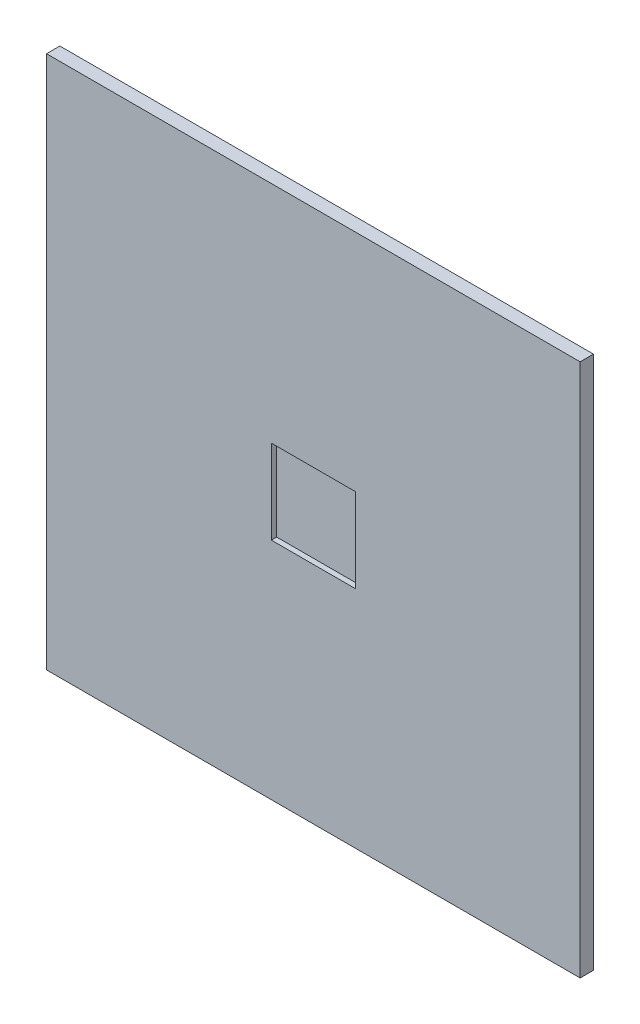
ISO-10303-21;
HEADER;
FILE_DESCRIPTION(('STEP AP214'),'2;1');
FILE_NAME('part.step','',(''),(''),'','','');
FILE_SCHEMA(('AUTOMOTIVE_DESIGN { 1 0 10303 214 1 1 1 1 }'));
ENDSEC;
DATA;
#1=APPLICATION_CONTEXT('core data for automotive mechanical design processes');
#2=APPLICATION_PROTOCOL_DEFINITION('international standard','automotive_design',2000,#1);
#3=PRODUCT_CONTEXT('',#1,'mechanical');
#4=PRODUCT('Part','Part','',(#3));
#5=PRODUCT_RELATED_PRODUCT_CATEGORY('part','',(#4));
#6=PRODUCT_DEFINITION_FORMATION('','',#4);
#7=PRODUCT_DEFINITION_CONTEXT('part definition',#1,'design');
#8=PRODUCT_DEFINITION('design','',#6,#7);
#9=PRODUCT_DEFINITION_SHAPE('','',#8);
#10=(LENGTH_UNIT() NAMED_UNIT(*) SI_UNIT(.MILLI.,.METRE.));
#11=(NAMED_UNIT(*) PLANE_ANGLE_UNIT() SI_UNIT($,.RADIAN.));
#12=(NAMED_UNIT(*) SI_UNIT($,.STERADIAN.) SOLID_ANGLE_UNIT());
#13=UNCERTAINTY_MEASURE_WITH_UNIT(LENGTH_MEASURE(1.E-05),#10,'distance_accuracy_value','');
#14=(GEOMETRIC_REPRESENTATION_CONTEXT(3) GLOBAL_UNCERTAINTY_ASSIGNED_CONTEXT((#13)) GLOBAL_UNIT_ASSIGNED_CONTEXT((#10,
#11,#12)) REPRESENTATION_CONTEXT('',''));
#15=CARTESIAN_POINT('',(0.,0.,0.));
#16=DIRECTION('',(0.,0.,1.));
#17=DIRECTION('',(1.,0.,0.));
#18=AXIS2_PLACEMENT_3D('',#15,#16,#17);
#19=CARTESIAN_POINT('',(0.,-20.,1.));
#20=DIRECTION('',(0.,1.,0.));
#21=DIRECTION('',(0.,0.,1.));
#22=AXIS2_PLACEMENT_3D('',#19,#20,#21);
#23=PLANE('',#22);
#24=DIRECTION('',(1.,0.,0.));
#25=VECTOR('',#24,1.);
#26=CARTESIAN_POINT('',(0.,-20.,0.));
#27=LINE('',#26,#25);
#28=CARTESIAN_POINT('',(-20.,-20.,0.));
#29=VERTEX_POINT('',#28);
#30=CARTESIAN_POINT('',(20.,-20.,0.));
#31=VERTEX_POINT('',#30);
#32=EDGE_CURVE('E148',#29,#31,#27,.T.);
#33=ORIENTED_EDGE('',*,*,#32,.T.);
#34=DIRECTION('',(0.,0.,-1.));
#35=VECTOR('',#34,1.);
#36=CARTESIAN_POINT('',(20.,-20.,1.));
#37=LINE('',#36,#35);
#38=CARTESIAN_POINT('',(20.,-20.,1.));
#39=VERTEX_POINT('',#38);
#40=EDGE_CURVE('E11',#39,#31,#37,.T.);
#41=ORIENTED_EDGE('',*,*,#40,.F.);
#42=DIRECTION('',(1.,0.,0.));
#43=VECTOR('',#42,1.);
#44=CARTESIAN_POINT('',(0.,-20.,1.));
#45=LINE('',#44,#43);
#46=CARTESIAN_POINT('',(-20.,-20.,1.));
#47=VERTEX_POINT('',#46);
#48=EDGE_CURVE('E152',#47,#39,#45,.T.);
#49=ORIENTED_EDGE('',*,*,#48,.F.);
#50=DIRECTION('',(0.,0.,-1.));
#51=VECTOR('',#50,1.);
#52=CARTESIAN_POINT('',(-20.,-20.,1.));
#53=LINE('',#52,#51);
#54=EDGE_CURVE('E64',#47,#29,#53,.T.);
#55=ORIENTED_EDGE('',*,*,#54,.T.);
#56=EDGE_LOOP('',(#33,#41,#49,#55));
#57=FACE_BOUND('',#56,.T.);
#58=ADVANCED_FACE('F41',(#57),#23,.F.);
#59=CARTESIAN_POINT('',(20.,0.,1.));
#60=DIRECTION('',(-1.,0.,0.));
#61=DIRECTION('',(0.,0.,1.));
#62=AXIS2_PLACEMENT_3D('',#59,#60,#61);
#63=PLANE('',#62);
#64=DIRECTION('',(0.,1.,0.));
#65=VECTOR('',#64,1.);
#66=CARTESIAN_POINT('',(20.,0.,0.));
#67=LINE('',#66,#65);
#68=CARTESIAN_POINT('',(20.,20.,0.));
#69=VERTEX_POINT('',#68);
#70=EDGE_CURVE('E162',#31,#69,#67,.T.);
#71=ORIENTED_EDGE('',*,*,#70,.T.);
#72=DIRECTION('',(0.,0.,-1.));
#73=VECTOR('',#72,1.);
#74=CARTESIAN_POINT('',(20.,20.,1.));
#75=LINE('',#74,#73);
#76=CARTESIAN_POINT('',(20.,20.,1.));
#77=VERTEX_POINT('',#76);
#78=EDGE_CURVE('E48',#77,#69,#75,.T.);
#79=ORIENTED_EDGE('',*,*,#78,.F.);
#80=DIRECTION('',(0.,1.,0.));
#81=VECTOR('',#80,1.);
#82=CARTESIAN_POINT('',(20.,0.,1.));
#83=LINE('',#82,#81);
#84=EDGE_CURVE('E90',#39,#77,#83,.T.);
#85=ORIENTED_EDGE('',*,*,#84,.F.);
#86=ORIENTED_EDGE('',*,*,#40,.T.);
#87=EDGE_LOOP('',(#71,#79,#85,#86));
#88=FACE_BOUND('',#87,.T.);
#89=ADVANCED_FACE('F176',(#88),#63,.F.);
#90=CARTESIAN_POINT('',(0.,20.,1.));
#91=DIRECTION('',(0.,1.,0.));
#92=DIRECTION('',(0.,0.,1.));
#93=AXIS2_PLACEMENT_3D('',#90,#91,#92);
#94=PLANE('',#93);
#95=DIRECTION('',(1.,0.,0.));
#96=VECTOR('',#95,1.);
#97=CARTESIAN_POINT('',(0.,20.,0.));
#98=LINE('',#97,#96);
#99=CARTESIAN_POINT('',(-20.,20.,0.));
#100=VERTEX_POINT('',#99);
#101=EDGE_CURVE('E165',#100,#69,#98,.T.);
#102=ORIENTED_EDGE('',*,*,#101,.F.);
#103=DIRECTION('',(0.,0.,-1.));
#104=VECTOR('',#103,1.);
#105=CARTESIAN_POINT('',(-20.,20.,1.));
#106=LINE('',#105,#104);
#107=CARTESIAN_POINT('',(-20.,20.,1.));
#108=VERTEX_POINT('',#107);
#109=EDGE_CURVE('E171',#108,#100,#106,.T.);
#110=ORIENTED_EDGE('',*,*,#109,.F.);
#111=DIRECTION('',(1.,0.,0.));
#112=VECTOR('',#111,1.);
#113=CARTESIAN_POINT('',(0.,20.,1.));
#114=LINE('',#113,#112);
#115=EDGE_CURVE('E156',#108,#77,#114,.T.);
#116=ORIENTED_EDGE('',*,*,#115,.T.);
#117=ORIENTED_EDGE('',*,*,#78,.T.);
#118=EDGE_LOOP('',(#102,#110,#116,#117));
#119=FACE_BOUND('',#118,.T.);
#120=ADVANCED_FACE('F174',(#119),#94,.T.);
#121=CARTESIAN_POINT('',(-20.,0.,1.));
#122=DIRECTION('',(-1.,0.,0.));
#123=DIRECTION('',(0.,0.,1.));
#124=AXIS2_PLACEMENT_3D('',#121,#122,#123);
#125=PLANE('',#124);
#126=DIRECTION('',(0.,1.,0.));
#127=VECTOR('',#126,1.);
#128=CARTESIAN_POINT('',(-20.,0.,0.));
#129=LINE('',#128,#127);
#130=EDGE_CURVE('E154',#29,#100,#129,.T.);
#131=ORIENTED_EDGE('',*,*,#130,.F.);
#132=ORIENTED_EDGE('',*,*,#54,.F.);
#133=DIRECTION('',(0.,1.,0.));
#134=VECTOR('',#133,1.);
#135=CARTESIAN_POINT('',(-20.,0.,1.));
#136=LINE('',#135,#134);
#137=EDGE_CURVE('E159',#47,#108,#136,.T.);
#138=ORIENTED_EDGE('',*,*,#137,.T.);
#139=ORIENTED_EDGE('',*,*,#109,.T.);
#140=EDGE_LOOP('',(#131,#132,#138,#139));
#141=FACE_BOUND('',#140,.T.);
#142=ADVANCED_FACE('F180',(#141),#125,.T.);
#143=CARTESIAN_POINT('',(0.,0.,1.));
#144=DIRECTION('',(0.,0.,1.));
#145=DIRECTION('',(1.,0.,0.));
#146=AXIS2_PLACEMENT_3D('',#143,#144,#145);
#147=PLANE('',#146);
#148=DIRECTION('',(0.,-1.,0.));
#149=VECTOR('',#148,1.);
#150=CARTESIAN_POINT('',(-3.15,0.,1.));
#151=LINE('',#150,#149);
#152=CARTESIAN_POINT('',(-3.15,3.15,1.));
#153=VERTEX_POINT('',#152);
#154=CARTESIAN_POINT('',(-3.15,-3.15,1.));
#155=VERTEX_POINT('',#154);
#156=EDGE_CURVE('E55',#153,#155,#151,.T.);
#157=ORIENTED_EDGE('',*,*,#156,.F.);
#158=DIRECTION('',(-1.,0.,0.));
#159=VECTOR('',#158,1.);
#160=CARTESIAN_POINT('',(0.,3.15,1.));
#161=LINE('',#160,#159);
#162=CARTESIAN_POINT('',(3.15,3.15,1.));
#163=VERTEX_POINT('',#162);
#164=EDGE_CURVE('E133',#163,#153,#161,.T.);
#165=ORIENTED_EDGE('',*,*,#164,.F.);
#166=DIRECTION('',(0.,-1.,0.));
#167=VECTOR('',#166,1.);
#168=CARTESIAN_POINT('',(3.15,0.,1.));
#169=LINE('',#168,#167);
#170=CARTESIAN_POINT('',(3.15,-3.15,1.));
#171=VERTEX_POINT('',#170);
#172=EDGE_CURVE('E136',#163,#171,#169,.T.);
#173=ORIENTED_EDGE('',*,*,#172,.T.);
#174=DIRECTION('',(-1.,0.,0.));
#175=VECTOR('',#174,1.);
#176=CARTESIAN_POINT('',(0.,-3.15,1.));
#177=LINE('',#176,#175);
#178=EDGE_CURVE('E142',#171,#155,#177,.T.);
#179=ORIENTED_EDGE('',*,*,#178,.T.);
#180=EDGE_LOOP('',(#157,#165,#173,#179));
#181=FACE_BOUND('',#180,.T.);
#182=ORIENTED_EDGE('',*,*,#48,.T.);
#183=ORIENTED_EDGE('',*,*,#84,.T.);
#184=ORIENTED_EDGE('',*,*,#115,.F.);
#185=ORIENTED_EDGE('',*,*,#137,.F.);
#186=EDGE_LOOP('',(#182,#183,#184,#185));
#187=FACE_BOUND('',#186,.T.);
#188=ADVANCED_FACE('F183',(#181,#187),#147,.T.);
#189=CARTESIAN_POINT('',(0.,0.,0.));
#190=DIRECTION('',(0.,0.,1.));
#191=DIRECTION('',(1.,0.,0.));
#192=AXIS2_PLACEMENT_3D('',#189,#190,#191);
#193=PLANE('',#192);
#194=ORIENTED_EDGE('',*,*,#32,.F.);
#195=ORIENTED_EDGE('',*,*,#130,.T.);
#196=ORIENTED_EDGE('',*,*,#101,.T.);
#197=ORIENTED_EDGE('',*,*,#70,.F.);
#198=EDGE_LOOP('',(#194,#195,#196,#197));
#199=FACE_BOUND('',#198,.T.);
#200=ADVANCED_FACE('F179',(#199),#193,.F.);
#201=CARTESIAN_POINT('',(-3.15,0.,0.6));
#202=DIRECTION('',(-1.,0.,0.));
#203=DIRECTION('',(0.,0.,1.));
#204=AXIS2_PLACEMENT_3D('',#201,#202,#203);
#205=PLANE('',#204);
#206=ORIENTED_EDGE('',*,*,#156,.T.);
#207=DIRECTION('',(0.,0.,1.));
#208=VECTOR('',#207,1.);
#209=CARTESIAN_POINT('',(-3.15,-3.15,0.6));
#210=LINE('',#209,#208);
#211=CARTESIAN_POINT('',(-3.15,-3.15,0.6));
#212=VERTEX_POINT('',#211);
#213=EDGE_CURVE('E117',#212,#155,#210,.T.);
#214=ORIENTED_EDGE('',*,*,#213,.F.);
#215=DIRECTION('',(0.,-1.,0.));
#216=VECTOR('',#215,1.);
#217=CARTESIAN_POINT('',(-3.15,0.,0.6));
#218=LINE('',#217,#216);
#219=CARTESIAN_POINT('',(-3.15,3.15,0.6));
#220=VERTEX_POINT('',#219);
#221=EDGE_CURVE('E124',#220,#212,#218,.T.);
#222=ORIENTED_EDGE('',*,*,#221,.F.);
#223=DIRECTION('',(0.,0.,1.));
#224=VECTOR('',#223,1.);
#225=CARTESIAN_POINT('',(-3.15,3.15,0.6));
#226=LINE('',#225,#224);
#227=EDGE_CURVE('E146',#220,#153,#226,.T.);
#228=ORIENTED_EDGE('',*,*,#227,.T.);
#229=EDGE_LOOP('',(#206,#214,#222,#228));
#230=FACE_BOUND('',#229,.T.);
#231=ADVANCED_FACE('F127',(#230),#205,.F.);
#232=CARTESIAN_POINT('',(0.,3.15,0.6));
#233=DIRECTION('',(0.,1.,0.));
#234=DIRECTION('',(0.,0.,1.));
#235=AXIS2_PLACEMENT_3D('',#232,#233,#234);
#236=PLANE('',#235);
#237=ORIENTED_EDGE('',*,*,#164,.T.);
#238=ORIENTED_EDGE('',*,*,#227,.F.);
#239=DIRECTION('',(-1.,0.,0.));
#240=VECTOR('',#239,1.);
#241=CARTESIAN_POINT('',(0.,3.15,0.6));
#242=LINE('',#241,#240);
#243=CARTESIAN_POINT('',(3.15,3.15,0.6));
#244=VERTEX_POINT('',#243);
#245=EDGE_CURVE('E129',#244,#220,#242,.T.);
#246=ORIENTED_EDGE('',*,*,#245,.F.);
#247=DIRECTION('',(0.,0.,1.));
#248=VECTOR('',#247,1.);
#249=CARTESIAN_POINT('',(3.15,3.15,0.6));
#250=LINE('',#249,#248);
#251=EDGE_CURVE('E149',#244,#163,#250,.T.);
#252=ORIENTED_EDGE('',*,*,#251,.T.);
#253=EDGE_LOOP('',(#237,#238,#246,#252));
#254=FACE_BOUND('',#253,.T.);
#255=ADVANCED_FACE('F202',(#254),#236,.F.);
#256=CARTESIAN_POINT('',(3.15,0.,0.6));
#257=DIRECTION('',(-1.,0.,0.));
#258=DIRECTION('',(0.,0.,1.));
#259=AXIS2_PLACEMENT_3D('',#256,#257,#258);
#260=PLANE('',#259);
#261=ORIENTED_EDGE('',*,*,#172,.F.);
#262=ORIENTED_EDGE('',*,*,#251,.F.);
#263=DIRECTION('',(0.,-1.,0.));
#264=VECTOR('',#263,1.);
#265=CARTESIAN_POINT('',(3.15,0.,0.6));
#266=LINE('',#265,#264);
#267=CARTESIAN_POINT('',(3.15,-3.15,0.6));
#268=VERTEX_POINT('',#267);
#269=EDGE_CURVE('E123',#244,#268,#266,.T.);
#270=ORIENTED_EDGE('',*,*,#269,.T.);
#271=DIRECTION('',(0.,0.,1.));
#272=VECTOR('',#271,1.);
#273=CARTESIAN_POINT('',(3.15,-3.15,0.6));
#274=LINE('',#273,#272);
#275=EDGE_CURVE('E119',#268,#171,#274,.T.);
#276=ORIENTED_EDGE('',*,*,#275,.T.);
#277=EDGE_LOOP('',(#261,#262,#270,#276));
#278=FACE_BOUND('',#277,.T.);
#279=ADVANCED_FACE('F205',(#278),#260,.T.);
#280=CARTESIAN_POINT('',(0.,-3.15,0.6));
#281=DIRECTION('',(0.,1.,0.));
#282=DIRECTION('',(0.,0.,1.));
#283=AXIS2_PLACEMENT_3D('',#280,#281,#282);
#284=PLANE('',#283);
#285=ORIENTED_EDGE('',*,*,#178,.F.);
#286=ORIENTED_EDGE('',*,*,#275,.F.);
#287=DIRECTION('',(-1.,0.,0.));
#288=VECTOR('',#287,1.);
#289=CARTESIAN_POINT('',(0.,-3.15,0.6));
#290=LINE('',#289,#288);
#291=EDGE_CURVE('E114',#268,#212,#290,.T.);
#292=ORIENTED_EDGE('',*,*,#291,.T.);
#293=ORIENTED_EDGE('',*,*,#213,.T.);
#294=EDGE_LOOP('',(#285,#286,#292,#293));
#295=FACE_BOUND('',#294,.T.);
#296=ADVANCED_FACE('F116',(#295),#284,.T.);
#297=CARTESIAN_POINT('',(0.,0.,0.6));
#298=DIRECTION('',(0.,0.,-1.));
#299=DIRECTION('',(-1.,0.,0.));
#300=AXIS2_PLACEMENT_3D('',#297,#298,#299);
#301=PLANE('',#300);
#302=ORIENTED_EDGE('',*,*,#221,.T.);
#303=ORIENTED_EDGE('',*,*,#291,.F.);
#304=ORIENTED_EDGE('',*,*,#269,.F.);
#305=ORIENTED_EDGE('',*,*,#245,.T.);
#306=EDGE_LOOP('',(#302,#303,#304,#305));
#307=FACE_BOUND('',#306,.T.);
#308=ADVANCED_FACE('F131',(#307),#301,.F.);
#309=CLOSED_SHELL('',(#58,#89,#120,#142,#188,#200,#231,#255,#279,#296,#308));
#310=MANIFOLD_SOLID_BREP('B2',#309);
#311=ADVANCED_BREP_SHAPE_REPRESENTATION('',(#18,#310),#14);
#312=SHAPE_DEFINITION_REPRESENTATION(#9,#311);
ENDSEC;
END-ISO-10303-21;
